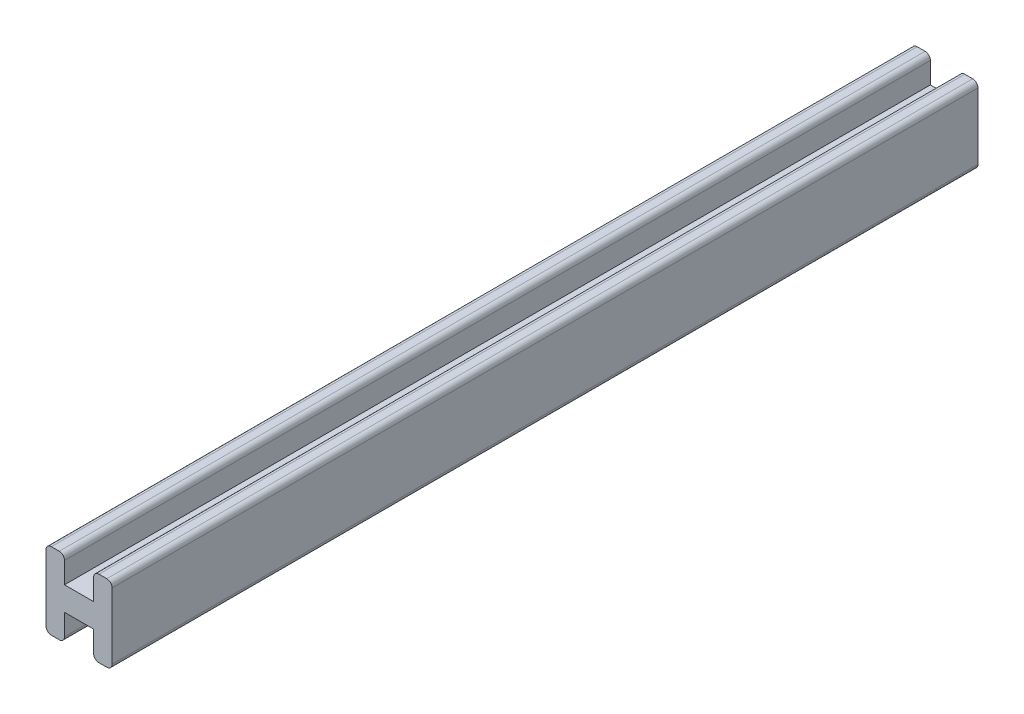
ISO-10303-21;
HEADER;
FILE_DESCRIPTION(('STEP AP214'),'2;1');
FILE_NAME('part.step','',(''),(''),'','','');
FILE_SCHEMA(('AUTOMOTIVE_DESIGN { 1 0 10303 214 1 1 1 1 }'));
ENDSEC;
DATA;
#1=APPLICATION_CONTEXT('core data for automotive mechanical design processes');
#2=APPLICATION_PROTOCOL_DEFINITION('international standard','automotive_design',2000,#1);
#3=PRODUCT_CONTEXT('',#1,'mechanical');
#4=PRODUCT('Part','Part','',(#3));
#5=PRODUCT_RELATED_PRODUCT_CATEGORY('part','',(#4));
#6=PRODUCT_DEFINITION_FORMATION('','',#4);
#7=PRODUCT_DEFINITION_CONTEXT('part definition',#1,'design');
#8=PRODUCT_DEFINITION('design','',#6,#7);
#9=PRODUCT_DEFINITION_SHAPE('','',#8);
#10=(LENGTH_UNIT() NAMED_UNIT(*) SI_UNIT(.MILLI.,.METRE.));
#11=(NAMED_UNIT(*) PLANE_ANGLE_UNIT() SI_UNIT($,.RADIAN.));
#12=(NAMED_UNIT(*) SI_UNIT($,.STERADIAN.) SOLID_ANGLE_UNIT());
#13=UNCERTAINTY_MEASURE_WITH_UNIT(LENGTH_MEASURE(1.E-05),#10,'distance_accuracy_value','');
#14=(GEOMETRIC_REPRESENTATION_CONTEXT(3) GLOBAL_UNCERTAINTY_ASSIGNED_CONTEXT((#13)) GLOBAL_UNIT_ASSIGNED_CONTEXT((#10,
#11,#12)) REPRESENTATION_CONTEXT('',''));
#15=CARTESIAN_POINT('',(0.,0.,0.));
#16=DIRECTION('',(0.,0.,1.));
#17=DIRECTION('',(1.,0.,0.));
#18=AXIS2_PLACEMENT_3D('',#15,#16,#17);
#19=CARTESIAN_POINT('',(-1.5,-4.,21.));
#20=DIRECTION('',(1.,0.,0.));
#21=DIRECTION('',(0.,0.,-1.));
#22=AXIS2_PLACEMENT_3D('',#19,#20,#21);
#23=PLANE('',#22);
#24=DIRECTION('',(0.,-1.,0.));
#25=VECTOR('',#24,1.);
#26=CARTESIAN_POINT('',(-1.5,-4.,16.5));
#27=LINE('',#26,#25);
#28=CARTESIAN_POINT('',(-1.5,1.5,16.5));
#29=VERTEX_POINT('',#28);
#30=CARTESIAN_POINT('',(-1.5,-3.5,16.5));
#31=VERTEX_POINT('',#30);
#32=EDGE_CURVE('E287',#29,#31,#27,.T.);
#33=ORIENTED_EDGE('',*,*,#32,.F.);
#34=DIRECTION('',(0.,0.,1.));
#35=VECTOR('',#34,1.);
#36=CARTESIAN_POINT('',(-1.5,1.5,21.));
#37=LINE('',#36,#35);
#38=CARTESIAN_POINT('',(-1.5,1.5,-49.));
#39=VERTEX_POINT('',#38);
#40=EDGE_CURVE('E232',#29,#39,#37,.F.);
#41=ORIENTED_EDGE('',*,*,#40,.T.);
#42=DIRECTION('',(0.,1.,0.));
#43=VECTOR('',#42,1.);
#44=CARTESIAN_POINT('',(-1.5,-3.9,-49.));
#45=LINE('',#44,#43);
#46=CARTESIAN_POINT('',(-1.5,-3.5,-49.));
#47=VERTEX_POINT('',#46);
#48=EDGE_CURVE('E256',#47,#39,#45,.T.);
#49=ORIENTED_EDGE('',*,*,#48,.F.);
#50=DIRECTION('',(0.,0.,1.));
#51=VECTOR('',#50,1.);
#52=CARTESIAN_POINT('',(-1.5,-3.5,21.));
#53=LINE('',#52,#51);
#54=EDGE_CURVE('E234',#47,#31,#53,.T.);
#55=ORIENTED_EDGE('',*,*,#54,.T.);
#56=EDGE_LOOP('',(#33,#41,#49,#55));
#57=FACE_BOUND('',#56,.T.);
#58=ADVANCED_FACE('F39',(#57),#23,.F.);
#59=CARTESIAN_POINT('',(3.5,2.,21.));
#60=DIRECTION('',(-1.,0.,0.));
#61=DIRECTION('',(0.,-1.,0.));
#62=AXIS2_PLACEMENT_3D('',#59,#60,#61);
#63=PLANE('',#62);
#64=DIRECTION('',(0.,1.,0.));
#65=VECTOR('',#64,1.);
#66=CARTESIAN_POINT('',(3.5,2.,16.5));
#67=LINE('',#66,#65);
#68=CARTESIAN_POINT('',(3.5,-3.5,16.5));
#69=VERTEX_POINT('',#68);
#70=CARTESIAN_POINT('',(3.5,1.5,16.5));
#71=VERTEX_POINT('',#70);
#72=EDGE_CURVE('E318',#69,#71,#67,.T.);
#73=ORIENTED_EDGE('',*,*,#72,.F.);
#74=DIRECTION('',(0.,0.,1.));
#75=VECTOR('',#74,1.);
#76=CARTESIAN_POINT('',(3.5,-3.5,21.));
#77=LINE('',#76,#75);
#78=CARTESIAN_POINT('',(3.5,-3.5,-49.));
#79=VERTEX_POINT('',#78);
#80=EDGE_CURVE('E195',#69,#79,#77,.F.);
#81=ORIENTED_EDGE('',*,*,#80,.T.);
#82=DIRECTION('',(0.,-1.,0.));
#83=VECTOR('',#82,1.);
#84=CARTESIAN_POINT('',(3.5,1.9,-49.));
#85=LINE('',#84,#83);
#86=CARTESIAN_POINT('',(3.5,1.5,-49.));
#87=VERTEX_POINT('',#86);
#88=EDGE_CURVE('E273',#87,#79,#85,.T.);
#89=ORIENTED_EDGE('',*,*,#88,.F.);
#90=DIRECTION('',(0.,0.,1.));
#91=VECTOR('',#90,1.);
#92=CARTESIAN_POINT('',(3.5,1.5,21.));
#93=LINE('',#92,#91);
#94=EDGE_CURVE('E197',#87,#71,#93,.T.);
#95=ORIENTED_EDGE('',*,*,#94,.T.);
#96=EDGE_LOOP('',(#73,#81,#89,#95));
#97=FACE_BOUND('',#96,.T.);
#98=ADVANCED_FACE('F333',(#97),#63,.F.);
#99=CARTESIAN_POINT('',(-1.5,-3.9,0.));
#100=DIRECTION('',(0.,1.,0.));
#101=DIRECTION('',(0.,0.,1.));
#102=AXIS2_PLACEMENT_3D('',#99,#100,#101);
#103=PLANE('',#102);
#104=DIRECTION('',(1.,0.,0.));
#105=VECTOR('',#104,1.);
#106=CARTESIAN_POINT('',(-1.5,-3.9,16.5));
#107=LINE('',#106,#105);
#108=CARTESIAN_POINT('',(-1.1,-3.9,16.5));
#109=VERTEX_POINT('',#108);
#110=CARTESIAN_POINT('',(-0.5,-3.9,16.5));
#111=VERTEX_POINT('',#110);
#112=EDGE_CURVE('E289',#109,#111,#107,.T.);
#113=ORIENTED_EDGE('',*,*,#112,.F.);
#114=DIRECTION('',(0.,0.,1.));
#115=VECTOR('',#114,1.);
#116=CARTESIAN_POINT('',(-1.1,-3.9,0.));
#117=LINE('',#116,#115);
#118=CARTESIAN_POINT('',(-1.1,-3.9,-49.));
#119=VERTEX_POINT('',#118);
#120=EDGE_CURVE('E210',#109,#119,#117,.F.);
#121=ORIENTED_EDGE('',*,*,#120,.T.);
#122=DIRECTION('',(-1.,0.,0.));
#123=VECTOR('',#122,1.);
#124=CARTESIAN_POINT('',(-0.1,-3.9,-49.));
#125=LINE('',#124,#123);
#126=CARTESIAN_POINT('',(-0.5,-3.9,-49.));
#127=VERTEX_POINT('',#126);
#128=EDGE_CURVE('E259',#127,#119,#125,.T.);
#129=ORIENTED_EDGE('',*,*,#128,.F.);
#130=DIRECTION('',(0.,0.,1.));
#131=VECTOR('',#130,1.);
#132=CARTESIAN_POINT('',(-0.5,-3.9,0.));
#133=LINE('',#132,#131);
#134=EDGE_CURVE('E212',#127,#111,#133,.T.);
#135=ORIENTED_EDGE('',*,*,#134,.T.);
#136=EDGE_LOOP('',(#113,#121,#129,#135));
#137=FACE_BOUND('',#136,.T.);
#138=ADVANCED_FACE('F369',(#137),#103,.F.);
#139=CARTESIAN_POINT('',(-0.1,-3.9,0.));
#140=DIRECTION('',(-1.,0.,0.));
#141=DIRECTION('',(0.,-1.,0.));
#142=AXIS2_PLACEMENT_3D('',#139,#140,#141);
#143=PLANE('',#142);
#144=DIRECTION('',(0.,1.,0.));
#145=VECTOR('',#144,1.);
#146=CARTESIAN_POINT('',(-0.1,-3.9,16.5));
#147=LINE('',#146,#145);
#148=CARTESIAN_POINT('',(-0.1,-3.5,16.5));
#149=VERTEX_POINT('',#148);
#150=CARTESIAN_POINT('',(-0.0999999999999998,-1.9,16.5));
#151=VERTEX_POINT('',#150);
#152=EDGE_CURVE('E297',#149,#151,#147,.T.);
#153=ORIENTED_EDGE('',*,*,#152,.F.);
#154=DIRECTION('',(0.,0.,1.));
#155=VECTOR('',#154,1.);
#156=CARTESIAN_POINT('',(-0.1,-3.5,0.));
#157=LINE('',#156,#155);
#158=CARTESIAN_POINT('',(-0.1,-3.5,-49.));
#159=VERTEX_POINT('',#158);
#160=EDGE_CURVE('E208',#149,#159,#157,.F.);
#161=ORIENTED_EDGE('',*,*,#160,.T.);
#162=DIRECTION('',(0.,-1.,0.));
#163=VECTOR('',#162,1.);
#164=CARTESIAN_POINT('',(-0.0999999999999998,-1.9,-49.));
#165=LINE('',#164,#163);
#166=CARTESIAN_POINT('',(-0.0999999999999998,-1.9,-49.));
#167=VERTEX_POINT('',#166);
#168=EDGE_CURVE('E262',#167,#159,#165,.T.);
#169=ORIENTED_EDGE('',*,*,#168,.F.);
#170=DIRECTION('',(0.,0.,1.));
#171=VECTOR('',#170,1.);
#172=CARTESIAN_POINT('',(-0.0999999999999998,-1.9,0.));
#173=LINE('',#172,#171);
#174=EDGE_CURVE('E242',#167,#151,#173,.T.);
#175=ORIENTED_EDGE('',*,*,#174,.T.);
#176=EDGE_LOOP('',(#153,#161,#169,#175));
#177=FACE_BOUND('',#176,.T.);
#178=ADVANCED_FACE('F360',(#177),#143,.F.);
#179=CARTESIAN_POINT('',(-0.0999999999999998,-1.9,0.));
#180=DIRECTION('',(0.,1.,0.));
#181=DIRECTION('',(0.,0.,1.));
#182=AXIS2_PLACEMENT_3D('',#179,#180,#181);
#183=PLANE('',#182);
#184=DIRECTION('',(1.,0.,0.));
#185=VECTOR('',#184,1.);
#186=CARTESIAN_POINT('',(-0.0999999999999998,-1.9,16.5));
#187=LINE('',#186,#185);
#188=CARTESIAN_POINT('',(2.1,-1.9,16.5));
#189=VERTEX_POINT('',#188);
#190=EDGE_CURVE('E299',#151,#189,#187,.T.);
#191=ORIENTED_EDGE('',*,*,#190,.F.);
#192=ORIENTED_EDGE('',*,*,#174,.F.);
#193=DIRECTION('',(-1.,0.,0.));
#194=VECTOR('',#193,1.);
#195=CARTESIAN_POINT('',(2.1,-1.9,-49.));
#196=LINE('',#195,#194);
#197=CARTESIAN_POINT('',(2.1,-1.9,-49.));
#198=VERTEX_POINT('',#197);
#199=EDGE_CURVE('E265',#198,#167,#196,.T.);
#200=ORIENTED_EDGE('',*,*,#199,.F.);
#201=DIRECTION('',(0.,0.,1.));
#202=VECTOR('',#201,1.);
#203=CARTESIAN_POINT('',(2.1,-1.9,0.));
#204=LINE('',#203,#202);
#205=EDGE_CURVE('E245',#198,#189,#204,.T.);
#206=ORIENTED_EDGE('',*,*,#205,.T.);
#207=EDGE_LOOP('',(#191,#192,#200,#206));
#208=FACE_BOUND('',#207,.T.);
#209=ADVANCED_FACE('F398',(#208),#183,.F.);
#210=CARTESIAN_POINT('',(2.1,-3.9,0.));
#211=DIRECTION('',(1.,0.,0.));
#212=DIRECTION('',(0.,0.,-1.));
#213=AXIS2_PLACEMENT_3D('',#210,#211,#212);
#214=PLANE('',#213);
#215=DIRECTION('',(0.,-1.,0.));
#216=VECTOR('',#215,1.);
#217=CARTESIAN_POINT('',(2.1,-3.9,16.5));
#218=LINE('',#217,#216);
#219=CARTESIAN_POINT('',(2.1,-3.5,16.5));
#220=VERTEX_POINT('',#219);
#221=EDGE_CURVE('E301',#189,#220,#218,.T.);
#222=ORIENTED_EDGE('',*,*,#221,.F.);
#223=ORIENTED_EDGE('',*,*,#205,.F.);
#224=DIRECTION('',(0.,1.,0.));
#225=VECTOR('',#224,1.);
#226=CARTESIAN_POINT('',(2.1,-3.9,-49.));
#227=LINE('',#226,#225);
#228=CARTESIAN_POINT('',(2.1,-3.5,-49.));
#229=VERTEX_POINT('',#228);
#230=EDGE_CURVE('E268',#229,#198,#227,.T.);
#231=ORIENTED_EDGE('',*,*,#230,.F.);
#232=DIRECTION('',(0.,0.,1.));
#233=VECTOR('',#232,1.);
#234=CARTESIAN_POINT('',(2.1,-3.5,0.));
#235=LINE('',#234,#233);
#236=EDGE_CURVE('E205',#229,#220,#235,.T.);
#237=ORIENTED_EDGE('',*,*,#236,.T.);
#238=EDGE_LOOP('',(#222,#223,#231,#237));
#239=FACE_BOUND('',#238,.T.);
#240=ADVANCED_FACE('F352',(#239),#214,.F.);
#241=CARTESIAN_POINT('',(3.5,-3.9,0.));
#242=DIRECTION('',(0.,1.,0.));
#243=DIRECTION('',(0.,0.,1.));
#244=AXIS2_PLACEMENT_3D('',#241,#242,#243);
#245=PLANE('',#244);
#246=DIRECTION('',(1.,0.,0.));
#247=VECTOR('',#246,1.);
#248=CARTESIAN_POINT('',(3.5,-3.9,16.5));
#249=LINE('',#248,#247);
#250=CARTESIAN_POINT('',(2.5,-3.9,16.5));
#251=VERTEX_POINT('',#250);
#252=CARTESIAN_POINT('',(3.1,-3.9,16.5));
#253=VERTEX_POINT('',#252);
#254=EDGE_CURVE('E311',#251,#253,#249,.T.);
#255=ORIENTED_EDGE('',*,*,#254,.F.);
#256=DIRECTION('',(0.,0.,1.));
#257=VECTOR('',#256,1.);
#258=CARTESIAN_POINT('',(2.5,-3.9,0.));
#259=LINE('',#258,#257);
#260=CARTESIAN_POINT('',(2.5,-3.9,-49.));
#261=VERTEX_POINT('',#260);
#262=EDGE_CURVE('E200',#251,#261,#259,.F.);
#263=ORIENTED_EDGE('',*,*,#262,.T.);
#264=DIRECTION('',(-1.,0.,0.));
#265=VECTOR('',#264,1.);
#266=CARTESIAN_POINT('',(3.5,-3.9,-49.));
#267=LINE('',#266,#265);
#268=CARTESIAN_POINT('',(3.1,-3.9,-49.));
#269=VERTEX_POINT('',#268);
#270=EDGE_CURVE('E270',#269,#261,#267,.T.);
#271=ORIENTED_EDGE('',*,*,#270,.F.);
#272=DIRECTION('',(0.,0.,1.));
#273=VECTOR('',#272,1.);
#274=CARTESIAN_POINT('',(3.1,-3.9,0.));
#275=LINE('',#274,#273);
#276=EDGE_CURVE('E202',#269,#253,#275,.T.);
#277=ORIENTED_EDGE('',*,*,#276,.T.);
#278=EDGE_LOOP('',(#255,#263,#271,#277));
#279=FACE_BOUND('',#278,.T.);
#280=ADVANCED_FACE('F343',(#279),#245,.F.);
#281=CARTESIAN_POINT('',(3.5,1.9,0.));
#282=DIRECTION('',(0.,-1.,0.));
#283=DIRECTION('',(0.,0.,-1.));
#284=AXIS2_PLACEMENT_3D('',#281,#282,#283);
#285=PLANE('',#284);
#286=DIRECTION('',(-1.,0.,0.));
#287=VECTOR('',#286,1.);
#288=CARTESIAN_POINT('',(3.5,1.9,16.5));
#289=LINE('',#288,#287);
#290=CARTESIAN_POINT('',(3.1,1.9,16.5));
#291=VERTEX_POINT('',#290);
#292=CARTESIAN_POINT('',(2.5,1.9,16.5));
#293=VERTEX_POINT('',#292);
#294=EDGE_CURVE('E54',#291,#293,#289,.T.);
#295=ORIENTED_EDGE('',*,*,#294,.F.);
#296=DIRECTION('',(0.,0.,1.));
#297=VECTOR('',#296,1.);
#298=CARTESIAN_POINT('',(3.1,1.9,0.));
#299=LINE('',#298,#297);
#300=CARTESIAN_POINT('',(3.1,1.9,-49.));
#301=VERTEX_POINT('',#300);
#302=EDGE_CURVE('E190',#291,#301,#299,.F.);
#303=ORIENTED_EDGE('',*,*,#302,.T.);
#304=DIRECTION('',(1.,0.,0.));
#305=VECTOR('',#304,1.);
#306=CARTESIAN_POINT('',(2.1,1.9,-49.));
#307=LINE('',#306,#305);
#308=CARTESIAN_POINT('',(2.5,1.9,-49.));
#309=VERTEX_POINT('',#308);
#310=EDGE_CURVE('E276',#309,#301,#307,.T.);
#311=ORIENTED_EDGE('',*,*,#310,.F.);
#312=DIRECTION('',(0.,0.,1.));
#313=VECTOR('',#312,1.);
#314=CARTESIAN_POINT('',(2.5,1.9,0.));
#315=LINE('',#314,#313);
#316=EDGE_CURVE('E191',#309,#293,#315,.T.);
#317=ORIENTED_EDGE('',*,*,#316,.T.);
#318=EDGE_LOOP('',(#295,#303,#311,#317));
#319=FACE_BOUND('',#318,.T.);
#320=ADVANCED_FACE('F439',(#319),#285,.F.);
#321=CARTESIAN_POINT('',(2.1,1.9,0.));
#322=DIRECTION('',(1.,0.,0.));
#323=DIRECTION('',(0.,0.,-1.));
#324=AXIS2_PLACEMENT_3D('',#321,#322,#323);
#325=PLANE('',#324);
#326=DIRECTION('',(0.,-1.,0.));
#327=VECTOR('',#326,1.);
#328=CARTESIAN_POINT('',(2.1,1.9,16.5));
#329=LINE('',#328,#327);
#330=CARTESIAN_POINT('',(2.1,1.5,16.5));
#331=VERTEX_POINT('',#330);
#332=CARTESIAN_POINT('',(2.1,-0.1,16.5));
#333=VERTEX_POINT('',#332);
#334=EDGE_CURVE('E175',#331,#333,#329,.T.);
#335=ORIENTED_EDGE('',*,*,#334,.F.);
#336=DIRECTION('',(0.,0.,1.));
#337=VECTOR('',#336,1.);
#338=CARTESIAN_POINT('',(2.1,1.5,0.));
#339=LINE('',#338,#337);
#340=CARTESIAN_POINT('',(2.1,1.5,-49.));
#341=VERTEX_POINT('',#340);
#342=EDGE_CURVE('E47',#331,#341,#339,.F.);
#343=ORIENTED_EDGE('',*,*,#342,.T.);
#344=DIRECTION('',(0.,1.,0.));
#345=VECTOR('',#344,1.);
#346=CARTESIAN_POINT('',(2.1,-0.1,-49.));
#347=LINE('',#346,#345);
#348=CARTESIAN_POINT('',(2.1,-0.1,-49.));
#349=VERTEX_POINT('',#348);
#350=EDGE_CURVE('E279',#349,#341,#347,.T.);
#351=ORIENTED_EDGE('',*,*,#350,.F.);
#352=DIRECTION('',(0.,0.,1.));
#353=VECTOR('',#352,1.);
#354=CARTESIAN_POINT('',(2.1,-0.1,0.));
#355=LINE('',#354,#353);
#356=EDGE_CURVE('E186',#349,#333,#355,.T.);
#357=ORIENTED_EDGE('',*,*,#356,.T.);
#358=EDGE_LOOP('',(#335,#343,#351,#357));
#359=FACE_BOUND('',#358,.T.);
#360=ADVANCED_FACE('F183',(#359),#325,.F.);
#361=CARTESIAN_POINT('',(-0.0999999999999998,-0.1,0.));
#362=DIRECTION('',(0.,-1.,0.));
#363=DIRECTION('',(0.,0.,-1.));
#364=AXIS2_PLACEMENT_3D('',#361,#362,#363);
#365=PLANE('',#364);
#366=DIRECTION('',(-1.,0.,0.));
#367=VECTOR('',#366,1.);
#368=CARTESIAN_POINT('',(-0.0999999999999998,-0.1,16.5));
#369=LINE('',#368,#367);
#370=CARTESIAN_POINT('',(-0.0999999999999998,-0.1,16.5));
#371=VERTEX_POINT('',#370);
#372=EDGE_CURVE('E320',#333,#371,#369,.T.);
#373=ORIENTED_EDGE('',*,*,#372,.F.);
#374=ORIENTED_EDGE('',*,*,#356,.F.);
#375=DIRECTION('',(1.,0.,0.));
#376=VECTOR('',#375,1.);
#377=CARTESIAN_POINT('',(-0.0999999999999998,-0.1,-49.));
#378=LINE('',#377,#376);
#379=CARTESIAN_POINT('',(-0.0999999999999998,-0.1,-49.));
#380=VERTEX_POINT('',#379);
#381=EDGE_CURVE('E281',#380,#349,#378,.T.);
#382=ORIENTED_EDGE('',*,*,#381,.F.);
#383=DIRECTION('',(0.,0.,1.));
#384=VECTOR('',#383,1.);
#385=CARTESIAN_POINT('',(-0.0999999999999998,-0.1,0.));
#386=LINE('',#385,#384);
#387=EDGE_CURVE('E249',#380,#371,#386,.T.);
#388=ORIENTED_EDGE('',*,*,#387,.T.);
#389=EDGE_LOOP('',(#373,#374,#382,#388));
#390=FACE_BOUND('',#389,.T.);
#391=ADVANCED_FACE('F396',(#390),#365,.F.);
#392=CARTESIAN_POINT('',(-0.1,1.9,0.));
#393=DIRECTION('',(-1.,0.,0.));
#394=DIRECTION('',(0.,-1.,0.));
#395=AXIS2_PLACEMENT_3D('',#392,#393,#394);
#396=PLANE('',#395);
#397=DIRECTION('',(0.,1.,0.));
#398=VECTOR('',#397,1.);
#399=CARTESIAN_POINT('',(-0.1,1.9,16.5));
#400=LINE('',#399,#398);
#401=CARTESIAN_POINT('',(-0.1,1.5,16.5));
#402=VERTEX_POINT('',#401);
#403=EDGE_CURVE('E313',#371,#402,#400,.T.);
#404=ORIENTED_EDGE('',*,*,#403,.F.);
#405=ORIENTED_EDGE('',*,*,#387,.F.);
#406=DIRECTION('',(0.,-1.,0.));
#407=VECTOR('',#406,1.);
#408=CARTESIAN_POINT('',(-0.1,1.9,-49.));
#409=LINE('',#408,#407);
#410=CARTESIAN_POINT('',(-0.1,1.5,-49.));
#411=VERTEX_POINT('',#410);
#412=EDGE_CURVE('E246',#411,#380,#409,.T.);
#413=ORIENTED_EDGE('',*,*,#412,.F.);
#414=DIRECTION('',(0.,0.,1.));
#415=VECTOR('',#414,1.);
#416=CARTESIAN_POINT('',(-0.1,1.5,0.));
#417=LINE('',#416,#415);
#418=EDGE_CURVE('E215',#411,#402,#417,.T.);
#419=ORIENTED_EDGE('',*,*,#418,.T.);
#420=EDGE_LOOP('',(#404,#405,#413,#419));
#421=FACE_BOUND('',#420,.T.);
#422=ADVANCED_FACE('F392',(#421),#396,.F.);
#423=CARTESIAN_POINT('',(-1.5,1.9,0.));
#424=DIRECTION('',(0.,-1.,0.));
#425=DIRECTION('',(0.,0.,-1.));
#426=AXIS2_PLACEMENT_3D('',#423,#424,#425);
#427=PLANE('',#426);
#428=DIRECTION('',(-1.,0.,0.));
#429=VECTOR('',#428,1.);
#430=CARTESIAN_POINT('',(-1.5,1.9,16.5));
#431=LINE('',#430,#429);
#432=CARTESIAN_POINT('',(-0.5,1.9,16.5));
#433=VERTEX_POINT('',#432);
#434=CARTESIAN_POINT('',(-1.1,1.9,16.5));
#435=VERTEX_POINT('',#434);
#436=EDGE_CURVE('E303',#433,#435,#431,.T.);
#437=ORIENTED_EDGE('',*,*,#436,.F.);
#438=DIRECTION('',(0.,0.,1.));
#439=VECTOR('',#438,1.);
#440=CARTESIAN_POINT('',(-0.5,1.9,0.));
#441=LINE('',#440,#439);
#442=CARTESIAN_POINT('',(-0.5,1.9,-49.));
#443=VERTEX_POINT('',#442);
#444=EDGE_CURVE('E240',#433,#443,#441,.F.);
#445=ORIENTED_EDGE('',*,*,#444,.T.);
#446=DIRECTION('',(1.,0.,0.));
#447=VECTOR('',#446,1.);
#448=CARTESIAN_POINT('',(-1.5,1.9,-49.));
#449=LINE('',#448,#447);
#450=CARTESIAN_POINT('',(-1.1,1.9,-49.));
#451=VERTEX_POINT('',#450);
#452=EDGE_CURVE('E254',#451,#443,#449,.T.);
#453=ORIENTED_EDGE('',*,*,#452,.F.);
#454=DIRECTION('',(0.,0.,1.));
#455=VECTOR('',#454,1.);
#456=CARTESIAN_POINT('',(-1.1,1.9,0.));
#457=LINE('',#456,#455);
#458=EDGE_CURVE('E237',#451,#435,#457,.T.);
#459=ORIENTED_EDGE('',*,*,#458,.T.);
#460=EDGE_LOOP('',(#437,#445,#453,#459));
#461=FACE_BOUND('',#460,.T.);
#462=ADVANCED_FACE('F385',(#461),#427,.F.);
#463=CARTESIAN_POINT('',(-1.1,1.5,0.));
#464=DIRECTION('',(0.,0.,1.));
#465=DIRECTION('',(1.,0.,0.));
#466=AXIS2_PLACEMENT_3D('',#463,#464,#465);
#467=CYLINDRICAL_SURFACE('',#466,0.4);
#468=ORIENTED_EDGE('',*,*,#40,.F.);
#469=CARTESIAN_POINT('',(-1.1,1.5,16.5));
#470=DIRECTION('',(0.,0.,1.));
#471=DIRECTION('',(1.,0.,0.));
#472=AXIS2_PLACEMENT_3D('',#469,#470,#471);
#473=CIRCLE('',#472,0.4);
#474=EDGE_CURVE('E291',#29,#435,#473,.F.);
#475=ORIENTED_EDGE('',*,*,#474,.T.);
#476=ORIENTED_EDGE('',*,*,#458,.F.);
#477=CARTESIAN_POINT('',(-1.1,1.5,-49.));
#478=DIRECTION('',(0.,0.,1.));
#479=DIRECTION('',(1.,0.,0.));
#480=AXIS2_PLACEMENT_3D('',#477,#478,#479);
#481=CIRCLE('',#480,0.4);
#482=EDGE_CURVE('E218',#39,#451,#481,.F.);
#483=ORIENTED_EDGE('',*,*,#482,.F.);
#484=EDGE_LOOP('',(#468,#475,#476,#483));
#485=FACE_BOUND('',#484,.T.);
#486=ADVANCED_FACE('F380',(#485),#467,.T.);
#487=CARTESIAN_POINT('',(-0.5,1.5,0.));
#488=DIRECTION('',(0.,0.,1.));
#489=DIRECTION('',(1.,0.,0.));
#490=AXIS2_PLACEMENT_3D('',#487,#488,#489);
#491=CYLINDRICAL_SURFACE('',#490,0.4);
#492=ORIENTED_EDGE('',*,*,#444,.F.);
#493=CARTESIAN_POINT('',(-0.5,1.5,16.5));
#494=DIRECTION('',(0.,0.,1.));
#495=DIRECTION('',(1.,0.,0.));
#496=AXIS2_PLACEMENT_3D('',#493,#494,#495);
#497=CIRCLE('',#496,0.4);
#498=EDGE_CURVE('E305',#433,#402,#497,.F.);
#499=ORIENTED_EDGE('',*,*,#498,.T.);
#500=ORIENTED_EDGE('',*,*,#418,.F.);
#501=CARTESIAN_POINT('',(-0.5,1.5,-49.));
#502=DIRECTION('',(0.,0.,1.));
#503=DIRECTION('',(1.,0.,0.));
#504=AXIS2_PLACEMENT_3D('',#501,#502,#503);
#505=CIRCLE('',#504,0.4);
#506=EDGE_CURVE('E61',#443,#411,#505,.F.);
#507=ORIENTED_EDGE('',*,*,#506,.F.);
#508=EDGE_LOOP('',(#492,#499,#500,#507));
#509=FACE_BOUND('',#508,.T.);
#510=ADVANCED_FACE('F388',(#509),#491,.T.);
#511=CARTESIAN_POINT('',(-1.1,-3.5,21.));
#512=DIRECTION('',(0.,0.,1.));
#513=DIRECTION('',(1.,0.,0.));
#514=AXIS2_PLACEMENT_3D('',#511,#512,#513);
#515=CYLINDRICAL_SURFACE('',#514,0.4);
#516=ORIENTED_EDGE('',*,*,#120,.F.);
#517=CARTESIAN_POINT('',(-1.1,-3.5,16.5));
#518=DIRECTION('',(0.,0.,1.));
#519=DIRECTION('',(1.,0.,0.));
#520=AXIS2_PLACEMENT_3D('',#517,#518,#519);
#521=CIRCLE('',#520,0.4);
#522=EDGE_CURVE('E284',#109,#31,#521,.F.);
#523=ORIENTED_EDGE('',*,*,#522,.T.);
#524=ORIENTED_EDGE('',*,*,#54,.F.);
#525=CARTESIAN_POINT('',(-1.1,-3.5,-49.));
#526=DIRECTION('',(0.,0.,1.));
#527=DIRECTION('',(1.,0.,0.));
#528=AXIS2_PLACEMENT_3D('',#525,#526,#527);
#529=CIRCLE('',#528,0.4);
#530=EDGE_CURVE('E221',#119,#47,#529,.F.);
#531=ORIENTED_EDGE('',*,*,#530,.F.);
#532=EDGE_LOOP('',(#516,#523,#524,#531));
#533=FACE_BOUND('',#532,.T.);
#534=ADVANCED_FACE('F372',(#533),#515,.T.);
#535=CARTESIAN_POINT('',(-0.5,-3.5,0.));
#536=DIRECTION('',(0.,0.,1.));
#537=DIRECTION('',(1.,0.,0.));
#538=AXIS2_PLACEMENT_3D('',#535,#536,#537);
#539=CYLINDRICAL_SURFACE('',#538,0.4);
#540=ORIENTED_EDGE('',*,*,#160,.F.);
#541=CARTESIAN_POINT('',(-0.5,-3.5,16.5));
#542=DIRECTION('',(0.,0.,1.));
#543=DIRECTION('',(1.,0.,0.));
#544=AXIS2_PLACEMENT_3D('',#541,#542,#543);
#545=CIRCLE('',#544,0.4);
#546=EDGE_CURVE('E294',#149,#111,#545,.F.);
#547=ORIENTED_EDGE('',*,*,#546,.T.);
#548=ORIENTED_EDGE('',*,*,#134,.F.);
#549=CARTESIAN_POINT('',(-0.5,-3.5,-49.));
#550=DIRECTION('',(0.,0.,1.));
#551=DIRECTION('',(1.,0.,0.));
#552=AXIS2_PLACEMENT_3D('',#549,#550,#551);
#553=CIRCLE('',#552,0.4);
#554=EDGE_CURVE('E223',#159,#127,#553,.F.);
#555=ORIENTED_EDGE('',*,*,#554,.F.);
#556=EDGE_LOOP('',(#540,#547,#548,#555));
#557=FACE_BOUND('',#556,.T.);
#558=ADVANCED_FACE('F363',(#557),#539,.T.);
#559=CARTESIAN_POINT('',(2.5,-3.5,0.));
#560=DIRECTION('',(0.,0.,1.));
#561=DIRECTION('',(1.,0.,0.));
#562=AXIS2_PLACEMENT_3D('',#559,#560,#561);
#563=CYLINDRICAL_SURFACE('',#562,0.4);
#564=ORIENTED_EDGE('',*,*,#262,.F.);
#565=CARTESIAN_POINT('',(2.5,-3.5,16.5));
#566=DIRECTION('',(0.,0.,1.));
#567=DIRECTION('',(1.,0.,0.));
#568=AXIS2_PLACEMENT_3D('',#565,#566,#567);
#569=CIRCLE('',#568,0.4);
#570=EDGE_CURVE('E308',#251,#220,#569,.F.);
#571=ORIENTED_EDGE('',*,*,#570,.T.);
#572=ORIENTED_EDGE('',*,*,#236,.F.);
#573=CARTESIAN_POINT('',(2.5,-3.5,-49.));
#574=DIRECTION('',(0.,0.,1.));
#575=DIRECTION('',(1.,0.,0.));
#576=AXIS2_PLACEMENT_3D('',#573,#574,#575);
#577=CIRCLE('',#576,0.4);
#578=EDGE_CURVE('E225',#261,#229,#577,.F.);
#579=ORIENTED_EDGE('',*,*,#578,.F.);
#580=EDGE_LOOP('',(#564,#571,#572,#579));
#581=FACE_BOUND('',#580,.T.);
#582=ADVANCED_FACE('F349',(#581),#563,.T.);
#583=CARTESIAN_POINT('',(3.1,-3.5,0.));
#584=DIRECTION('',(0.,0.,1.));
#585=DIRECTION('',(1.,0.,0.));
#586=AXIS2_PLACEMENT_3D('',#583,#584,#585);
#587=CYLINDRICAL_SURFACE('',#586,0.4);
#588=ORIENTED_EDGE('',*,*,#80,.F.);
#589=CARTESIAN_POINT('',(3.1,-3.5,16.5));
#590=DIRECTION('',(0.,0.,1.));
#591=DIRECTION('',(1.,0.,0.));
#592=AXIS2_PLACEMENT_3D('',#589,#590,#591);
#593=CIRCLE('',#592,0.4);
#594=EDGE_CURVE('E315',#69,#253,#593,.F.);
#595=ORIENTED_EDGE('',*,*,#594,.T.);
#596=ORIENTED_EDGE('',*,*,#276,.F.);
#597=CARTESIAN_POINT('',(3.1,-3.5,-49.));
#598=DIRECTION('',(0.,0.,1.));
#599=DIRECTION('',(1.,0.,0.));
#600=AXIS2_PLACEMENT_3D('',#597,#598,#599);
#601=CIRCLE('',#600,0.4);
#602=EDGE_CURVE('E227',#79,#269,#601,.F.);
#603=ORIENTED_EDGE('',*,*,#602,.F.);
#604=EDGE_LOOP('',(#588,#595,#596,#603));
#605=FACE_BOUND('',#604,.T.);
#606=ADVANCED_FACE('F340',(#605),#587,.T.);
#607=CARTESIAN_POINT('',(3.1,1.5,21.));
#608=DIRECTION('',(0.,0.,1.));
#609=DIRECTION('',(1.,0.,0.));
#610=AXIS2_PLACEMENT_3D('',#607,#608,#609);
#611=CYLINDRICAL_SURFACE('',#610,0.4);
#612=ORIENTED_EDGE('',*,*,#302,.F.);
#613=CARTESIAN_POINT('',(3.1,1.5,16.5));
#614=DIRECTION('',(0.,0.,1.));
#615=DIRECTION('',(1.,0.,0.));
#616=AXIS2_PLACEMENT_3D('',#613,#614,#615);
#617=CIRCLE('',#616,0.4);
#618=EDGE_CURVE('E322',#291,#71,#617,.F.);
#619=ORIENTED_EDGE('',*,*,#618,.T.);
#620=ORIENTED_EDGE('',*,*,#94,.F.);
#621=CARTESIAN_POINT('',(3.1,1.5,-49.));
#622=DIRECTION('',(0.,0.,1.));
#623=DIRECTION('',(1.,0.,0.));
#624=AXIS2_PLACEMENT_3D('',#621,#622,#623);
#625=CIRCLE('',#624,0.4);
#626=EDGE_CURVE('E229',#301,#87,#625,.F.);
#627=ORIENTED_EDGE('',*,*,#626,.F.);
#628=EDGE_LOOP('',(#612,#619,#620,#627));
#629=FACE_BOUND('',#628,.T.);
#630=ADVANCED_FACE('F328',(#629),#611,.T.);
#631=CARTESIAN_POINT('',(2.5,1.5,0.));
#632=DIRECTION('',(0.,0.,1.));
#633=DIRECTION('',(1.,0.,0.));
#634=AXIS2_PLACEMENT_3D('',#631,#632,#633);
#635=CYLINDRICAL_SURFACE('',#634,0.4);
#636=ORIENTED_EDGE('',*,*,#342,.F.);
#637=CARTESIAN_POINT('',(2.5,1.5,16.5));
#638=DIRECTION('',(0.,0.,1.));
#639=DIRECTION('',(1.,0.,0.));
#640=AXIS2_PLACEMENT_3D('',#637,#638,#639);
#641=CIRCLE('',#640,0.4);
#642=EDGE_CURVE('E11',#331,#293,#641,.F.);
#643=ORIENTED_EDGE('',*,*,#642,.T.);
#644=ORIENTED_EDGE('',*,*,#316,.F.);
#645=CARTESIAN_POINT('',(2.5,1.5,-49.));
#646=DIRECTION('',(0.,0.,1.));
#647=DIRECTION('',(1.,0.,0.));
#648=AXIS2_PLACEMENT_3D('',#645,#646,#647);
#649=CIRCLE('',#648,0.4);
#650=EDGE_CURVE('E189',#341,#309,#649,.F.);
#651=ORIENTED_EDGE('',*,*,#650,.F.);
#652=EDGE_LOOP('',(#636,#643,#644,#651));
#653=FACE_BOUND('',#652,.T.);
#654=ADVANCED_FACE('F41',(#653),#635,.T.);
#655=CARTESIAN_POINT('',(0.,0.,-49.));
#656=DIRECTION('',(0.,0.,1.));
#657=DIRECTION('',(1.,0.,0.));
#658=AXIS2_PLACEMENT_3D('',#655,#656,#657);
#659=PLANE('',#658);
#660=ORIENTED_EDGE('',*,*,#48,.T.);
#661=ORIENTED_EDGE('',*,*,#482,.T.);
#662=ORIENTED_EDGE('',*,*,#452,.T.);
#663=ORIENTED_EDGE('',*,*,#506,.T.);
#664=ORIENTED_EDGE('',*,*,#412,.T.);
#665=ORIENTED_EDGE('',*,*,#381,.T.);
#666=ORIENTED_EDGE('',*,*,#350,.T.);
#667=ORIENTED_EDGE('',*,*,#650,.T.);
#668=ORIENTED_EDGE('',*,*,#310,.T.);
#669=ORIENTED_EDGE('',*,*,#626,.T.);
#670=ORIENTED_EDGE('',*,*,#88,.T.);
#671=ORIENTED_EDGE('',*,*,#602,.T.);
#672=ORIENTED_EDGE('',*,*,#270,.T.);
#673=ORIENTED_EDGE('',*,*,#578,.T.);
#674=ORIENTED_EDGE('',*,*,#230,.T.);
#675=ORIENTED_EDGE('',*,*,#199,.T.);
#676=ORIENTED_EDGE('',*,*,#168,.T.);
#677=ORIENTED_EDGE('',*,*,#554,.T.);
#678=ORIENTED_EDGE('',*,*,#128,.T.);
#679=ORIENTED_EDGE('',*,*,#530,.T.);
#680=EDGE_LOOP('',(#660,#661,#662,#663,#664,#665,#666,#667,#668,#669,#670,#671,#672,#673,#674,
#675,#676,#677,#678,#679));
#681=FACE_BOUND('',#680,.T.);
#682=ADVANCED_FACE('F336',(#681),#659,.F.);
#683=CARTESIAN_POINT('',(0.,0.,16.5));
#684=DIRECTION('',(0.,0.,1.));
#685=DIRECTION('',(1.,0.,0.));
#686=AXIS2_PLACEMENT_3D('',#683,#684,#685);
#687=PLANE('',#686);
#688=ORIENTED_EDGE('',*,*,#112,.T.);
#689=ORIENTED_EDGE('',*,*,#546,.F.);
#690=ORIENTED_EDGE('',*,*,#152,.T.);
#691=ORIENTED_EDGE('',*,*,#190,.T.);
#692=ORIENTED_EDGE('',*,*,#221,.T.);
#693=ORIENTED_EDGE('',*,*,#570,.F.);
#694=ORIENTED_EDGE('',*,*,#254,.T.);
#695=ORIENTED_EDGE('',*,*,#594,.F.);
#696=ORIENTED_EDGE('',*,*,#72,.T.);
#697=ORIENTED_EDGE('',*,*,#618,.F.);
#698=ORIENTED_EDGE('',*,*,#294,.T.);
#699=ORIENTED_EDGE('',*,*,#642,.F.);
#700=ORIENTED_EDGE('',*,*,#334,.T.);
#701=ORIENTED_EDGE('',*,*,#372,.T.);
#702=ORIENTED_EDGE('',*,*,#403,.T.);
#703=ORIENTED_EDGE('',*,*,#498,.F.);
#704=ORIENTED_EDGE('',*,*,#436,.T.);
#705=ORIENTED_EDGE('',*,*,#474,.F.);
#706=ORIENTED_EDGE('',*,*,#32,.T.);
#707=ORIENTED_EDGE('',*,*,#522,.F.);
#708=EDGE_LOOP('',(#688,#689,#690,#691,#692,#693,#694,#695,#696,#697,#698,#699,#700,#701,#702,
#703,#704,#705,#706,#707));
#709=FACE_BOUND('',#708,.T.);
#710=ADVANCED_FACE('F174',(#709),#687,.T.);
#711=CLOSED_SHELL('',(#58,#98,#138,#178,#209,#240,#280,#320,#360,#391,#422,#462,#486,#510,#534,
#558,#582,#606,#630,#654,#682,#710));
#712=MANIFOLD_SOLID_BREP('B2',#711);
#713=ADVANCED_BREP_SHAPE_REPRESENTATION('',(#18,#712),#14);
#714=SHAPE_DEFINITION_REPRESENTATION(#9,#713);
ENDSEC;
END-ISO-10303-21;
